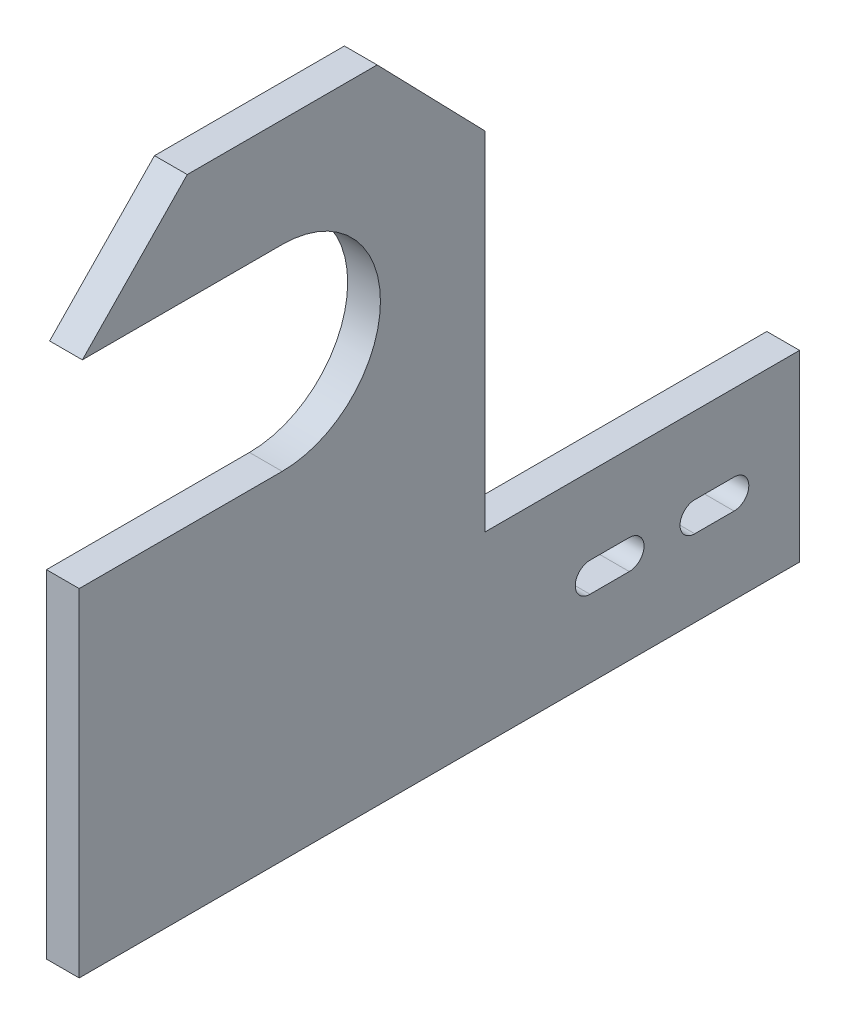
ISO-10303-21;
HEADER;
FILE_DESCRIPTION(('STEP AP214'),'2;1');
FILE_NAME('part.step','',(''),(''),'','','');
FILE_SCHEMA(('AUTOMOTIVE_DESIGN { 1 0 10303 214 1 1 1 1 }'));
ENDSEC;
DATA;
#1=APPLICATION_CONTEXT('core data for automotive mechanical design processes');
#2=APPLICATION_PROTOCOL_DEFINITION('international standard','automotive_design',2000,#1);
#3=PRODUCT_CONTEXT('',#1,'mechanical');
#4=PRODUCT('Part','Part','',(#3));
#5=PRODUCT_RELATED_PRODUCT_CATEGORY('part','',(#4));
#6=PRODUCT_DEFINITION_FORMATION('','',#4);
#7=PRODUCT_DEFINITION_CONTEXT('part definition',#1,'design');
#8=PRODUCT_DEFINITION('design','',#6,#7);
#9=PRODUCT_DEFINITION_SHAPE('','',#8);
#10=(LENGTH_UNIT() NAMED_UNIT(*) SI_UNIT(.MILLI.,.METRE.));
#11=(NAMED_UNIT(*) PLANE_ANGLE_UNIT() SI_UNIT($,.RADIAN.));
#12=(NAMED_UNIT(*) SI_UNIT($,.STERADIAN.) SOLID_ANGLE_UNIT());
#13=UNCERTAINTY_MEASURE_WITH_UNIT(LENGTH_MEASURE(1.E-05),#10,'distance_accuracy_value','');
#14=(GEOMETRIC_REPRESENTATION_CONTEXT(3) GLOBAL_UNCERTAINTY_ASSIGNED_CONTEXT((#13)) GLOBAL_UNIT_ASSIGNED_CONTEXT((#10,
#11,#12)) REPRESENTATION_CONTEXT('',''));
#15=CARTESIAN_POINT('',(0.,0.,0.));
#16=DIRECTION('',(0.,0.,1.));
#17=DIRECTION('',(1.,0.,0.));
#18=AXIS2_PLACEMENT_3D('',#15,#16,#17);
#19=CARTESIAN_POINT('',(-5.,49.5,-30.9999999999999));
#20=DIRECTION('',(0.,1.,0.));
#21=DIRECTION('',(0.,0.,1.));
#22=AXIS2_PLACEMENT_3D('',#19,#20,#21);
#23=PLANE('',#22);
#24=DIRECTION('',(0.,0.,1.));
#25=VECTOR('',#24,1.);
#26=CARTESIAN_POINT('',(0.,49.5,-30.9999999999999));
#27=LINE('',#26,#25);
#28=CARTESIAN_POINT('',(0.,49.5,-30.9999999999999));
#29=VERTEX_POINT('',#28);
#30=CARTESIAN_POINT('',(0.,49.5,-0.485294117647064));
#31=VERTEX_POINT('',#30);
#32=EDGE_CURVE('E143',#29,#31,#27,.T.);
#33=ORIENTED_EDGE('',*,*,#32,.T.);
#34=DIRECTION('',(1.,0.,0.));
#35=VECTOR('',#34,1.);
#36=CARTESIAN_POINT('',(-5.,49.5,-0.485294117647064));
#37=LINE('',#36,#35);
#38=CARTESIAN_POINT('',(-5.,49.5,-0.485294117647064));
#39=VERTEX_POINT('',#38);
#40=EDGE_CURVE('E11',#39,#31,#37,.T.);
#41=ORIENTED_EDGE('',*,*,#40,.F.);
#42=DIRECTION('',(0.,0.,1.));
#43=VECTOR('',#42,1.);
#44=CARTESIAN_POINT('',(-5.,49.5,-30.9999999999999));
#45=LINE('',#44,#43);
#46=CARTESIAN_POINT('',(-5.,49.5,-30.9999999999999));
#47=VERTEX_POINT('',#46);
#48=EDGE_CURVE('E167',#47,#39,#45,.T.);
#49=ORIENTED_EDGE('',*,*,#48,.F.);
#50=DIRECTION('',(1.,0.,0.));
#51=VECTOR('',#50,1.);
#52=CARTESIAN_POINT('',(-5.,49.5,-30.9999999999999));
#53=LINE('',#52,#51);
#54=EDGE_CURVE('E139',#47,#29,#53,.T.);
#55=ORIENTED_EDGE('',*,*,#54,.T.);
#56=EDGE_LOOP('',(#33,#41,#49,#55));
#57=FACE_BOUND('',#56,.T.);
#58=ADVANCED_FACE('F39',(#57),#23,.F.);
#59=CARTESIAN_POINT('',(-5.,49.5,-0.485294117647064));
#60=DIRECTION('',(0.,-0.69647537716866,-0.717580691628317));
#61=DIRECTION('',(0.,0.717580691628317,-0.69647537716866));
#62=AXIS2_PLACEMENT_3D('',#59,#60,#61);
#63=PLANE('',#62);
#64=DIRECTION('',(0.,0.717580691628317,-0.69647537716866));
#65=VECTOR('',#64,1.);
#66=CARTESIAN_POINT('',(0.,49.5,-0.485294117647064));
#67=LINE('',#66,#65);
#68=CARTESIAN_POINT('',(0.,66.,-16.5));
#69=VERTEX_POINT('',#68);
#70=EDGE_CURVE('E147',#31,#69,#67,.T.);
#71=ORIENTED_EDGE('',*,*,#70,.T.);
#72=DIRECTION('',(1.,0.,0.));
#73=VECTOR('',#72,1.);
#74=CARTESIAN_POINT('',(-5.,66.,-16.5));
#75=LINE('',#74,#73);
#76=CARTESIAN_POINT('',(-5.,66.,-16.5));
#77=VERTEX_POINT('',#76);
#78=EDGE_CURVE('E48',#77,#69,#75,.T.);
#79=ORIENTED_EDGE('',*,*,#78,.F.);
#80=DIRECTION('',(0.,0.717580691628317,-0.69647537716866));
#81=VECTOR('',#80,1.);
#82=CARTESIAN_POINT('',(-5.,49.5,-0.485294117647064));
#83=LINE('',#82,#81);
#84=EDGE_CURVE('E97',#39,#77,#83,.T.);
#85=ORIENTED_EDGE('',*,*,#84,.F.);
#86=ORIENTED_EDGE('',*,*,#40,.T.);
#87=EDGE_LOOP('',(#71,#79,#85,#86));
#88=FACE_BOUND('',#87,.T.);
#89=ADVANCED_FACE('F417',(#88),#63,.F.);
#90=CARTESIAN_POINT('',(-5.,66.,-16.5));
#91=DIRECTION('',(0.,-1.,0.));
#92=DIRECTION('',(0.,0.,-1.));
#93=AXIS2_PLACEMENT_3D('',#90,#91,#92);
#94=PLANE('',#93);
#95=DIRECTION('',(0.,0.,-1.));
#96=VECTOR('',#95,1.);
#97=CARTESIAN_POINT('',(0.,66.,-16.5));
#98=LINE('',#97,#96);
#99=CARTESIAN_POINT('',(0.,66.,-45.5));
#100=VERTEX_POINT('',#99);
#101=EDGE_CURVE('E150',#69,#100,#98,.T.);
#102=ORIENTED_EDGE('',*,*,#101,.T.);
#103=DIRECTION('',(1.,0.,0.));
#104=VECTOR('',#103,1.);
#105=CARTESIAN_POINT('',(-5.,66.,-45.5));
#106=LINE('',#105,#104);
#107=CARTESIAN_POINT('',(-5.,66.,-45.5));
#108=VERTEX_POINT('',#107);
#109=EDGE_CURVE('E174',#108,#100,#106,.T.);
#110=ORIENTED_EDGE('',*,*,#109,.F.);
#111=DIRECTION('',(0.,0.,-1.));
#112=VECTOR('',#111,1.);
#113=CARTESIAN_POINT('',(-5.,66.,-16.5));
#114=LINE('',#113,#112);
#115=EDGE_CURVE('E184',#77,#108,#114,.T.);
#116=ORIENTED_EDGE('',*,*,#115,.F.);
#117=ORIENTED_EDGE('',*,*,#78,.T.);
#118=EDGE_LOOP('',(#102,#110,#116,#117));
#119=FACE_BOUND('',#118,.T.);
#120=ADVANCED_FACE('F182',(#119),#94,.F.);
#121=CARTESIAN_POINT('',(-5.,66.,-45.5));
#122=DIRECTION('',(0.,-0.69647537716866,0.717580691628316));
#123=DIRECTION('',(0.,-0.717580691628316,-0.69647537716866));
#124=AXIS2_PLACEMENT_3D('',#121,#122,#123);
#125=PLANE('',#124);
#126=DIRECTION('',(0.,-0.717580691628316,-0.69647537716866));
#127=VECTOR('',#126,1.);
#128=CARTESIAN_POINT('',(0.,66.,-45.5));
#129=LINE('',#128,#127);
#130=CARTESIAN_POINT('',(0.,49.,-62.));
#131=VERTEX_POINT('',#130);
#132=EDGE_CURVE('E153',#100,#131,#129,.T.);
#133=ORIENTED_EDGE('',*,*,#132,.T.);
#134=DIRECTION('',(1.,0.,0.));
#135=VECTOR('',#134,1.);
#136=CARTESIAN_POINT('',(-5.,49.,-62.));
#137=LINE('',#136,#135);
#138=CARTESIAN_POINT('',(-5.,49.,-62.));
#139=VERTEX_POINT('',#138);
#140=EDGE_CURVE('E132',#139,#131,#137,.T.);
#141=ORIENTED_EDGE('',*,*,#140,.F.);
#142=DIRECTION('',(0.,-0.717580691628316,-0.69647537716866));
#143=VECTOR('',#142,1.);
#144=CARTESIAN_POINT('',(-5.,66.,-45.5));
#145=LINE('',#144,#143);
#146=EDGE_CURVE('E197',#108,#139,#145,.T.);
#147=ORIENTED_EDGE('',*,*,#146,.F.);
#148=ORIENTED_EDGE('',*,*,#109,.T.);
#149=EDGE_LOOP('',(#133,#141,#147,#148));
#150=FACE_BOUND('',#149,.T.);
#151=ADVANCED_FACE('F194',(#150),#125,.F.);
#152=CARTESIAN_POINT('',(-5.,0.,-62.));
#153=DIRECTION('',(0.,0.,-1.));
#154=DIRECTION('',(-1.,0.,0.));
#155=AXIS2_PLACEMENT_3D('',#152,#153,#154);
#156=PLANE('',#155);
#157=DIRECTION('',(0.,1.,0.));
#158=VECTOR('',#157,1.);
#159=CARTESIAN_POINT('',(0.,0.,-62.));
#160=LINE('',#159,#158);
#161=CARTESIAN_POINT('',(0.,-4.,-62.));
#162=VERTEX_POINT('',#161);
#163=EDGE_CURVE('E157',#162,#131,#160,.T.);
#164=ORIENTED_EDGE('',*,*,#163,.F.);
#165=DIRECTION('',(1.,0.,0.));
#166=VECTOR('',#165,1.);
#167=CARTESIAN_POINT('',(-119.560027932957,-4.,-62.));
#168=LINE('',#167,#166);
#169=CARTESIAN_POINT('',(-5.,-4.,-62.));
#170=VERTEX_POINT('',#169);
#171=EDGE_CURVE('E214',#170,#162,#168,.T.);
#172=ORIENTED_EDGE('',*,*,#171,.F.);
#173=DIRECTION('',(0.,1.,0.));
#174=VECTOR('',#173,1.);
#175=CARTESIAN_POINT('',(-5.,0.,-62.));
#176=LINE('',#175,#174);
#177=EDGE_CURVE('E125',#170,#139,#176,.T.);
#178=ORIENTED_EDGE('',*,*,#177,.T.);
#179=ORIENTED_EDGE('',*,*,#140,.T.);
#180=EDGE_LOOP('',(#164,#172,#178,#179));
#181=FACE_BOUND('',#180,.T.);
#182=ADVANCED_FACE('F439',(#181),#156,.T.);
#183=CARTESIAN_POINT('',(-5.,0.,0.));
#184=DIRECTION('',(0.,0.,-1.));
#185=DIRECTION('',(-1.,0.,0.));
#186=AXIS2_PLACEMENT_3D('',#183,#184,#185);
#187=PLANE('',#186);
#188=DIRECTION('',(0.,1.,0.));
#189=VECTOR('',#188,1.);
#190=CARTESIAN_POINT('',(0.,0.,0.));
#191=LINE('',#190,#189);
#192=CARTESIAN_POINT('',(0.,-32.,0.));
#193=VERTEX_POINT('',#192);
#194=CARTESIAN_POINT('',(0.,19.5,0.));
#195=VERTEX_POINT('',#194);
#196=EDGE_CURVE('E130',#193,#195,#191,.T.);
#197=ORIENTED_EDGE('',*,*,#196,.T.);
#198=DIRECTION('',(1.,0.,0.));
#199=VECTOR('',#198,1.);
#200=CARTESIAN_POINT('',(-5.,19.5,0.));
#201=LINE('',#200,#199);
#202=CARTESIAN_POINT('',(-5.,19.5,0.));
#203=VERTEX_POINT('',#202);
#204=EDGE_CURVE('E127',#203,#195,#201,.T.);
#205=ORIENTED_EDGE('',*,*,#204,.F.);
#206=DIRECTION('',(0.,1.,0.));
#207=VECTOR('',#206,1.);
#208=CARTESIAN_POINT('',(-5.,0.,0.));
#209=LINE('',#208,#207);
#210=CARTESIAN_POINT('',(-5.,-32.,0.));
#211=VERTEX_POINT('',#210);
#212=EDGE_CURVE('E111',#211,#203,#209,.T.);
#213=ORIENTED_EDGE('',*,*,#212,.F.);
#214=DIRECTION('',(1.,0.,0.));
#215=VECTOR('',#214,1.);
#216=CARTESIAN_POINT('',(-119.560027932957,-32.,0.));
#217=LINE('',#216,#215);
#218=EDGE_CURVE('E215',#211,#193,#217,.T.);
#219=ORIENTED_EDGE('',*,*,#218,.T.);
#220=EDGE_LOOP('',(#197,#205,#213,#219));
#221=FACE_BOUND('',#220,.T.);
#222=ADVANCED_FACE('F128',(#221),#187,.F.);
#223=CARTESIAN_POINT('',(-5.,19.5,0.));
#224=DIRECTION('',(0.,-1.,0.));
#225=DIRECTION('',(0.,0.,-1.));
#226=AXIS2_PLACEMENT_3D('',#223,#224,#225);
#227=PLANE('',#226);
#228=DIRECTION('',(0.,0.,-1.));
#229=VECTOR('',#228,1.);
#230=CARTESIAN_POINT('',(0.,19.5,0.));
#231=LINE('',#230,#229);
#232=CARTESIAN_POINT('',(0.,19.5,-31.));
#233=VERTEX_POINT('',#232);
#234=EDGE_CURVE('E83',#195,#233,#231,.T.);
#235=ORIENTED_EDGE('',*,*,#234,.T.);
#236=DIRECTION('',(1.,0.,0.));
#237=VECTOR('',#236,1.);
#238=CARTESIAN_POINT('',(-5.,19.5,-31.));
#239=LINE('',#238,#237);
#240=CARTESIAN_POINT('',(-5.,19.5,-31.));
#241=VERTEX_POINT('',#240);
#242=EDGE_CURVE('E133',#241,#233,#239,.T.);
#243=ORIENTED_EDGE('',*,*,#242,.F.);
#244=DIRECTION('',(0.,0.,-1.));
#245=VECTOR('',#244,1.);
#246=CARTESIAN_POINT('',(-5.,19.5,0.));
#247=LINE('',#246,#245);
#248=EDGE_CURVE('E116',#203,#241,#247,.T.);
#249=ORIENTED_EDGE('',*,*,#248,.F.);
#250=ORIENTED_EDGE('',*,*,#204,.T.);
#251=EDGE_LOOP('',(#235,#243,#249,#250));
#252=FACE_BOUND('',#251,.T.);
#253=ADVANCED_FACE('F135',(#252),#227,.F.);
#254=CARTESIAN_POINT('',(-5.,34.5,-31.));
#255=DIRECTION('',(1.,0.,0.));
#256=DIRECTION('',(0.,0.,-1.));
#257=AXIS2_PLACEMENT_3D('',#254,#255,#256);
#258=CYLINDRICAL_SURFACE('',#257,15.);
#259=CARTESIAN_POINT('',(0.,34.5,-31.));
#260=DIRECTION('',(1.,0.,0.));
#261=DIRECTION('',(0.,0.,-1.));
#262=AXIS2_PLACEMENT_3D('',#259,#260,#261);
#263=CIRCLE('',#262,15.);
#264=EDGE_CURVE('E89',#233,#29,#263,.T.);
#265=ORIENTED_EDGE('',*,*,#264,.T.);
#266=ORIENTED_EDGE('',*,*,#54,.F.);
#267=CARTESIAN_POINT('',(-5.,34.5,-31.));
#268=DIRECTION('',(1.,0.,0.));
#269=DIRECTION('',(0.,0.,-1.));
#270=AXIS2_PLACEMENT_3D('',#267,#268,#269);
#271=CIRCLE('',#270,15.);
#272=EDGE_CURVE('E56',#241,#47,#271,.T.);
#273=ORIENTED_EDGE('',*,*,#272,.F.);
#274=ORIENTED_EDGE('',*,*,#242,.T.);
#275=EDGE_LOOP('',(#265,#266,#273,#274));
#276=FACE_BOUND('',#275,.T.);
#277=ADVANCED_FACE('F465',(#276),#258,.F.);
#278=CARTESIAN_POINT('',(-5.,34.5,-31.));
#279=DIRECTION('',(1.,0.,0.));
#280=DIRECTION('',(0.,0.,-1.));
#281=AXIS2_PLACEMENT_3D('',#278,#279,#280);
#282=PLANE('',#281);
#283=ORIENTED_EDGE('',*,*,#48,.T.);
#284=ORIENTED_EDGE('',*,*,#84,.T.);
#285=ORIENTED_EDGE('',*,*,#115,.T.);
#286=ORIENTED_EDGE('',*,*,#146,.T.);
#287=ORIENTED_EDGE('',*,*,#177,.F.);
#288=DIRECTION('',(0.,0.,-1.));
#289=VECTOR('',#288,1.);
#290=CARTESIAN_POINT('',(-5.,-4.,-62.));
#291=LINE('',#290,#289);
#292=CARTESIAN_POINT('',(-5.,-4.,-110.));
#293=VERTEX_POINT('',#292);
#294=EDGE_CURVE('E304',#170,#293,#291,.T.);
#295=ORIENTED_EDGE('',*,*,#294,.T.);
#296=DIRECTION('',(0.,-1.,0.));
#297=VECTOR('',#296,1.);
#298=CARTESIAN_POINT('',(-5.,-32.,-110.));
#299=LINE('',#298,#297);
#300=CARTESIAN_POINT('',(-5.00000000000003,-32.,-110.));
#301=VERTEX_POINT('',#300);
#302=EDGE_CURVE('E309',#293,#301,#299,.T.);
#303=ORIENTED_EDGE('',*,*,#302,.T.);
#304=DIRECTION('',(0.,0.,1.));
#305=VECTOR('',#304,1.);
#306=CARTESIAN_POINT('',(-5.,-32.,0.));
#307=LINE('',#306,#305);
#308=EDGE_CURVE('E120',#301,#211,#307,.T.);
#309=ORIENTED_EDGE('',*,*,#308,.T.);
#310=ORIENTED_EDGE('',*,*,#212,.T.);
#311=ORIENTED_EDGE('',*,*,#248,.T.);
#312=ORIENTED_EDGE('',*,*,#272,.T.);
#313=EDGE_LOOP('',(#283,#284,#285,#286,#287,#295,#303,#309,#310,#311,#312));
#314=FACE_BOUND('',#313,.T.);
#315=DIRECTION('',(0.,0.,1.));
#316=VECTOR('',#315,1.);
#317=CARTESIAN_POINT('',(-5.,-20.25,-93.9999999999999));
#318=LINE('',#317,#316);
#319=CARTESIAN_POINT('',(-5.,-20.25,-99.9999999999999));
#320=VERTEX_POINT('',#319);
#321=CARTESIAN_POINT('',(-5.00000000000003,-20.25,-93.9999999999999));
#322=VERTEX_POINT('',#321);
#323=EDGE_CURVE('E209',#320,#322,#318,.T.);
#324=ORIENTED_EDGE('',*,*,#323,.F.);
#325=CARTESIAN_POINT('',(-5.,-18.,-99.9999999999999));
#326=DIRECTION('',(1.,0.,0.));
#327=DIRECTION('',(0.,0.,-1.));
#328=AXIS2_PLACEMENT_3D('',#325,#326,#327);
#329=CIRCLE('',#328,2.25000000000001);
#330=CARTESIAN_POINT('',(-5.,-15.75,-99.9999999999999));
#331=VERTEX_POINT('',#330);
#332=EDGE_CURVE('E320',#331,#320,#329,.F.);
#333=ORIENTED_EDGE('',*,*,#332,.F.);
#334=DIRECTION('',(0.,0.,-1.));
#335=VECTOR('',#334,1.);
#336=CARTESIAN_POINT('',(-5.,-15.75,-93.9999999999999));
#337=LINE('',#336,#335);
#338=CARTESIAN_POINT('',(-5.,-15.75,-93.9999999999999));
#339=VERTEX_POINT('',#338);
#340=EDGE_CURVE('E333',#339,#331,#337,.T.);
#341=ORIENTED_EDGE('',*,*,#340,.F.);
#342=CARTESIAN_POINT('',(-5.,-18.,-93.9999999999999));
#343=DIRECTION('',(1.,0.,0.));
#344=DIRECTION('',(0.,0.,-1.));
#345=AXIS2_PLACEMENT_3D('',#342,#343,#344);
#346=CIRCLE('',#345,2.25000000000001);
#347=EDGE_CURVE('E308',#322,#339,#346,.F.);
#348=ORIENTED_EDGE('',*,*,#347,.F.);
#349=EDGE_LOOP('',(#324,#333,#341,#348));
#350=FACE_BOUND('',#349,.T.);
#351=DIRECTION('',(0.,0.,1.));
#352=VECTOR('',#351,1.);
#353=CARTESIAN_POINT('',(-5.,-20.25,-77.9999999999999));
#354=LINE('',#353,#352);
#355=CARTESIAN_POINT('',(-5.,-20.25,-83.9999999999999));
#356=VERTEX_POINT('',#355);
#357=CARTESIAN_POINT('',(-5.00000000000003,-20.25,-77.9999999999999));
#358=VERTEX_POINT('',#357);
#359=EDGE_CURVE('E213',#356,#358,#354,.T.);
#360=ORIENTED_EDGE('',*,*,#359,.F.);
#361=CARTESIAN_POINT('',(-5.,-18.,-83.9999999999999));
#362=DIRECTION('',(1.,0.,0.));
#363=DIRECTION('',(0.,0.,-1.));
#364=AXIS2_PLACEMENT_3D('',#361,#362,#363);
#365=CIRCLE('',#364,2.25000000000001);
#366=CARTESIAN_POINT('',(-5.,-15.75,-83.9999999999999));
#367=VERTEX_POINT('',#366);
#368=EDGE_CURVE('E314',#367,#356,#365,.F.);
#369=ORIENTED_EDGE('',*,*,#368,.F.);
#370=DIRECTION('',(0.,0.,-1.));
#371=VECTOR('',#370,1.);
#372=CARTESIAN_POINT('',(-5.,-15.75,-77.9999999999999));
#373=LINE('',#372,#371);
#374=CARTESIAN_POINT('',(-5.,-15.75,-77.9999999999999));
#375=VERTEX_POINT('',#374);
#376=EDGE_CURVE('E319',#375,#367,#373,.T.);
#377=ORIENTED_EDGE('',*,*,#376,.F.);
#378=CARTESIAN_POINT('',(-5.,-18.,-77.9999999999999));
#379=DIRECTION('',(1.,0.,0.));
#380=DIRECTION('',(0.,0.,-1.));
#381=AXIS2_PLACEMENT_3D('',#378,#379,#380);
#382=CIRCLE('',#381,2.25000000000001);
#383=EDGE_CURVE('E315',#358,#375,#382,.F.);
#384=ORIENTED_EDGE('',*,*,#383,.F.);
#385=EDGE_LOOP('',(#360,#369,#377,#384));
#386=FACE_BOUND('',#385,.T.);
#387=ADVANCED_FACE('F113',(#314,#350,#386),#282,.F.);
#388=CARTESIAN_POINT('',(0.,34.5,-31.));
#389=DIRECTION('',(1.,0.,0.));
#390=DIRECTION('',(0.,0.,-1.));
#391=AXIS2_PLACEMENT_3D('',#388,#389,#390);
#392=PLANE('',#391);
#393=ORIENTED_EDGE('',*,*,#32,.F.);
#394=ORIENTED_EDGE('',*,*,#264,.F.);
#395=ORIENTED_EDGE('',*,*,#234,.F.);
#396=ORIENTED_EDGE('',*,*,#196,.F.);
#397=DIRECTION('',(0.,0.,-1.));
#398=VECTOR('',#397,1.);
#399=CARTESIAN_POINT('',(0.,-32.,0.));
#400=LINE('',#399,#398);
#401=CARTESIAN_POINT('',(0.,-32.,-110.));
#402=VERTEX_POINT('',#401);
#403=EDGE_CURVE('E236',#193,#402,#400,.T.);
#404=ORIENTED_EDGE('',*,*,#403,.T.);
#405=DIRECTION('',(0.,1.,0.));
#406=VECTOR('',#405,1.);
#407=CARTESIAN_POINT('',(0.,-32.,-110.));
#408=LINE('',#407,#406);
#409=CARTESIAN_POINT('',(0.,-4.,-110.));
#410=VERTEX_POINT('',#409);
#411=EDGE_CURVE('E232',#402,#410,#408,.T.);
#412=ORIENTED_EDGE('',*,*,#411,.T.);
#413=DIRECTION('',(0.,0.,1.));
#414=VECTOR('',#413,1.);
#415=CARTESIAN_POINT('',(0.,-4.,-62.));
#416=LINE('',#415,#414);
#417=EDGE_CURVE('E219',#410,#162,#416,.T.);
#418=ORIENTED_EDGE('',*,*,#417,.T.);
#419=ORIENTED_EDGE('',*,*,#163,.T.);
#420=ORIENTED_EDGE('',*,*,#132,.F.);
#421=ORIENTED_EDGE('',*,*,#101,.F.);
#422=ORIENTED_EDGE('',*,*,#70,.F.);
#423=EDGE_LOOP('',(#393,#394,#395,#396,#404,#412,#418,#419,#420,#421,#422));
#424=FACE_BOUND('',#423,.T.);
#425=CARTESIAN_POINT('',(0.,-18.,-93.9999999999999));
#426=DIRECTION('',(1.,0.,0.));
#427=DIRECTION('',(0.,0.,-1.));
#428=AXIS2_PLACEMENT_3D('',#425,#426,#427);
#429=CIRCLE('',#428,2.25000000000001);
#430=CARTESIAN_POINT('',(0.,-15.75,-93.9999999999999));
#431=VERTEX_POINT('',#430);
#432=CARTESIAN_POINT('',(0.,-20.25,-93.9999999999999));
#433=VERTEX_POINT('',#432);
#434=EDGE_CURVE('E300',#431,#433,#429,.T.);
#435=ORIENTED_EDGE('',*,*,#434,.F.);
#436=DIRECTION('',(0.,0.,1.));
#437=VECTOR('',#436,1.);
#438=CARTESIAN_POINT('',(0.,-15.75,-93.9999999999999));
#439=LINE('',#438,#437);
#440=CARTESIAN_POINT('',(0.,-15.75,-99.9999999999999));
#441=VERTEX_POINT('',#440);
#442=EDGE_CURVE('E278',#441,#431,#439,.T.);
#443=ORIENTED_EDGE('',*,*,#442,.F.);
#444=CARTESIAN_POINT('',(0.,-18.,-99.9999999999999));
#445=DIRECTION('',(1.,0.,0.));
#446=DIRECTION('',(0.,0.,-1.));
#447=AXIS2_PLACEMENT_3D('',#444,#445,#446);
#448=CIRCLE('',#447,2.25000000000001);
#449=CARTESIAN_POINT('',(0.,-20.25,-99.9999999999999));
#450=VERTEX_POINT('',#449);
#451=EDGE_CURVE('E292',#450,#441,#448,.T.);
#452=ORIENTED_EDGE('',*,*,#451,.F.);
#453=DIRECTION('',(0.,0.,-1.));
#454=VECTOR('',#453,1.);
#455=CARTESIAN_POINT('',(0.,-20.25,-93.9999999999999));
#456=LINE('',#455,#454);
#457=EDGE_CURVE('E296',#433,#450,#456,.T.);
#458=ORIENTED_EDGE('',*,*,#457,.F.);
#459=EDGE_LOOP('',(#435,#443,#452,#458));
#460=FACE_BOUND('',#459,.T.);
#461=CARTESIAN_POINT('',(0.,-18.,-77.9999999999999));
#462=DIRECTION('',(1.,0.,0.));
#463=DIRECTION('',(0.,0.,-1.));
#464=AXIS2_PLACEMENT_3D('',#461,#462,#463);
#465=CIRCLE('',#464,2.25000000000001);
#466=CARTESIAN_POINT('',(0.,-15.75,-77.9999999999999));
#467=VERTEX_POINT('',#466);
#468=CARTESIAN_POINT('',(0.,-20.25,-77.9999999999999));
#469=VERTEX_POINT('',#468);
#470=EDGE_CURVE('E268',#467,#469,#465,.T.);
#471=ORIENTED_EDGE('',*,*,#470,.F.);
#472=DIRECTION('',(0.,0.,1.));
#473=VECTOR('',#472,1.);
#474=CARTESIAN_POINT('',(0.,-15.75,-77.9999999999999));
#475=LINE('',#474,#473);
#476=CARTESIAN_POINT('',(0.,-15.75,-83.9999999999999));
#477=VERTEX_POINT('',#476);
#478=EDGE_CURVE('E246',#477,#467,#475,.T.);
#479=ORIENTED_EDGE('',*,*,#478,.F.);
#480=CARTESIAN_POINT('',(0.,-18.,-83.9999999999999));
#481=DIRECTION('',(1.,0.,0.));
#482=DIRECTION('',(0.,0.,-1.));
#483=AXIS2_PLACEMENT_3D('',#480,#481,#482);
#484=CIRCLE('',#483,2.25000000000001);
#485=CARTESIAN_POINT('',(0.,-20.25,-83.9999999999999));
#486=VERTEX_POINT('',#485);
#487=EDGE_CURVE('E260',#486,#477,#484,.T.);
#488=ORIENTED_EDGE('',*,*,#487,.F.);
#489=DIRECTION('',(0.,0.,-1.));
#490=VECTOR('',#489,1.);
#491=CARTESIAN_POINT('',(0.,-20.25,-77.9999999999999));
#492=LINE('',#491,#490);
#493=EDGE_CURVE('E264',#469,#486,#492,.T.);
#494=ORIENTED_EDGE('',*,*,#493,.F.);
#495=EDGE_LOOP('',(#471,#479,#488,#494));
#496=FACE_BOUND('',#495,.T.);
#497=ADVANCED_FACE('F188',(#424,#460,#496),#392,.T.);
#498=CARTESIAN_POINT('',(-119.560027932957,-32.,0.));
#499=DIRECTION('',(0.,-1.,0.));
#500=DIRECTION('',(0.,0.,-1.));
#501=AXIS2_PLACEMENT_3D('',#498,#499,#500);
#502=PLANE('',#501);
#503=ORIENTED_EDGE('',*,*,#308,.F.);
#504=DIRECTION('',(1.,0.,0.));
#505=VECTOR('',#504,1.);
#506=CARTESIAN_POINT('',(-119.560027932957,-32.,-110.));
#507=LINE('',#506,#505);
#508=EDGE_CURVE('E218',#301,#402,#507,.T.);
#509=ORIENTED_EDGE('',*,*,#508,.T.);
#510=ORIENTED_EDGE('',*,*,#403,.F.);
#511=ORIENTED_EDGE('',*,*,#218,.F.);
#512=EDGE_LOOP('',(#503,#509,#510,#511));
#513=FACE_BOUND('',#512,.T.);
#514=ADVANCED_FACE('F426',(#513),#502,.T.);
#515=CARTESIAN_POINT('',(-119.560027932957,-32.,-110.));
#516=DIRECTION('',(0.,0.,-1.));
#517=DIRECTION('',(-1.,0.,0.));
#518=AXIS2_PLACEMENT_3D('',#515,#516,#517);
#519=PLANE('',#518);
#520=ORIENTED_EDGE('',*,*,#302,.F.);
#521=DIRECTION('',(1.,0.,0.));
#522=VECTOR('',#521,1.);
#523=CARTESIAN_POINT('',(-119.560027932957,-4.,-110.));
#524=LINE('',#523,#522);
#525=EDGE_CURVE('E223',#293,#410,#524,.T.);
#526=ORIENTED_EDGE('',*,*,#525,.T.);
#527=ORIENTED_EDGE('',*,*,#411,.F.);
#528=ORIENTED_EDGE('',*,*,#508,.F.);
#529=EDGE_LOOP('',(#520,#526,#527,#528));
#530=FACE_BOUND('',#529,.T.);
#531=ADVANCED_FACE('F431',(#530),#519,.T.);
#532=CARTESIAN_POINT('',(-119.560027932957,-4.,-62.));
#533=DIRECTION('',(0.,1.,0.));
#534=DIRECTION('',(0.,0.,1.));
#535=AXIS2_PLACEMENT_3D('',#532,#533,#534);
#536=PLANE('',#535);
#537=ORIENTED_EDGE('',*,*,#294,.F.);
#538=ORIENTED_EDGE('',*,*,#171,.T.);
#539=ORIENTED_EDGE('',*,*,#417,.F.);
#540=ORIENTED_EDGE('',*,*,#525,.F.);
#541=EDGE_LOOP('',(#537,#538,#539,#540));
#542=FACE_BOUND('',#541,.T.);
#543=ADVANCED_FACE('F436',(#542),#536,.T.);
#544=CARTESIAN_POINT('',(-119.560027932957,-20.25,-77.9999999999999));
#545=DIRECTION('',(0.,-1.,0.));
#546=DIRECTION('',(0.,0.,-1.));
#547=AXIS2_PLACEMENT_3D('',#544,#545,#546);
#548=PLANE('',#547);
#549=DIRECTION('',(1.,0.,0.));
#550=VECTOR('',#549,1.);
#551=CARTESIAN_POINT('',(-119.560027932957,-20.25,-83.9999999999999));
#552=LINE('',#551,#550);
#553=EDGE_CURVE('E245',#356,#486,#552,.T.);
#554=ORIENTED_EDGE('',*,*,#553,.F.);
#555=ORIENTED_EDGE('',*,*,#359,.T.);
#556=DIRECTION('',(1.,0.,0.));
#557=VECTOR('',#556,1.);
#558=CARTESIAN_POINT('',(-119.560027932957,-20.25,-77.9999999999999));
#559=LINE('',#558,#557);
#560=EDGE_CURVE('E241',#358,#469,#559,.T.);
#561=ORIENTED_EDGE('',*,*,#560,.T.);
#562=ORIENTED_EDGE('',*,*,#493,.T.);
#563=EDGE_LOOP('',(#554,#555,#561,#562));
#564=FACE_BOUND('',#563,.T.);
#565=ADVANCED_FACE('F526',(#564),#548,.F.);
#566=CARTESIAN_POINT('',(-119.560027932957,-18.,-83.9999999999999));
#567=DIRECTION('',(1.,0.,0.));
#568=DIRECTION('',(0.,0.,-1.));
#569=AXIS2_PLACEMENT_3D('',#566,#567,#568);
#570=CYLINDRICAL_SURFACE('',#569,2.25000000000001);
#571=DIRECTION('',(1.,0.,0.));
#572=VECTOR('',#571,1.);
#573=CARTESIAN_POINT('',(-119.560027932957,-15.75,-83.9999999999999));
#574=LINE('',#573,#572);
#575=EDGE_CURVE('E250',#367,#477,#574,.T.);
#576=ORIENTED_EDGE('',*,*,#575,.F.);
#577=ORIENTED_EDGE('',*,*,#368,.T.);
#578=ORIENTED_EDGE('',*,*,#553,.T.);
#579=ORIENTED_EDGE('',*,*,#487,.T.);
#580=EDGE_LOOP('',(#576,#577,#578,#579));
#581=FACE_BOUND('',#580,.T.);
#582=ADVANCED_FACE('F535',(#581),#570,.F.);
#583=CARTESIAN_POINT('',(-119.560027932957,-15.75,-77.9999999999999));
#584=DIRECTION('',(0.,1.,0.));
#585=DIRECTION('',(0.,0.,1.));
#586=AXIS2_PLACEMENT_3D('',#583,#584,#585);
#587=PLANE('',#586);
#588=DIRECTION('',(1.,0.,0.));
#589=VECTOR('',#588,1.);
#590=CARTESIAN_POINT('',(-119.560027932957,-15.75,-77.9999999999999));
#591=LINE('',#590,#589);
#592=EDGE_CURVE('E240',#375,#467,#591,.T.);
#593=ORIENTED_EDGE('',*,*,#592,.F.);
#594=ORIENTED_EDGE('',*,*,#376,.T.);
#595=ORIENTED_EDGE('',*,*,#575,.T.);
#596=ORIENTED_EDGE('',*,*,#478,.T.);
#597=EDGE_LOOP('',(#593,#594,#595,#596));
#598=FACE_BOUND('',#597,.T.);
#599=ADVANCED_FACE('F545',(#598),#587,.F.);
#600=CARTESIAN_POINT('',(-119.560027932957,-18.,-77.9999999999999));
#601=DIRECTION('',(1.,0.,0.));
#602=DIRECTION('',(0.,0.,-1.));
#603=AXIS2_PLACEMENT_3D('',#600,#601,#602);
#604=CYLINDRICAL_SURFACE('',#603,2.25000000000001);
#605=ORIENTED_EDGE('',*,*,#560,.F.);
#606=ORIENTED_EDGE('',*,*,#383,.T.);
#607=ORIENTED_EDGE('',*,*,#592,.T.);
#608=ORIENTED_EDGE('',*,*,#470,.T.);
#609=EDGE_LOOP('',(#605,#606,#607,#608));
#610=FACE_BOUND('',#609,.T.);
#611=ADVANCED_FACE('F555',(#610),#604,.F.);
#612=CARTESIAN_POINT('',(-119.560027932957,-20.25,-93.9999999999999));
#613=DIRECTION('',(0.,-1.,0.));
#614=DIRECTION('',(0.,0.,-1.));
#615=AXIS2_PLACEMENT_3D('',#612,#613,#614);
#616=PLANE('',#615);
#617=DIRECTION('',(1.,0.,0.));
#618=VECTOR('',#617,1.);
#619=CARTESIAN_POINT('',(-119.560027932957,-20.25,-99.9999999999999));
#620=LINE('',#619,#618);
#621=EDGE_CURVE('E277',#320,#450,#620,.T.);
#622=ORIENTED_EDGE('',*,*,#621,.F.);
#623=ORIENTED_EDGE('',*,*,#323,.T.);
#624=DIRECTION('',(1.,0.,0.));
#625=VECTOR('',#624,1.);
#626=CARTESIAN_POINT('',(-119.560027932957,-20.25,-93.9999999999999));
#627=LINE('',#626,#625);
#628=EDGE_CURVE('E273',#322,#433,#627,.T.);
#629=ORIENTED_EDGE('',*,*,#628,.T.);
#630=ORIENTED_EDGE('',*,*,#457,.T.);
#631=EDGE_LOOP('',(#622,#623,#629,#630));
#632=FACE_BOUND('',#631,.T.);
#633=ADVANCED_FACE('F350',(#632),#616,.F.);
#634=CARTESIAN_POINT('',(-119.560027932957,-18.,-99.9999999999999));
#635=DIRECTION('',(1.,0.,0.));
#636=DIRECTION('',(0.,0.,-1.));
#637=AXIS2_PLACEMENT_3D('',#634,#635,#636);
#638=CYLINDRICAL_SURFACE('',#637,2.25000000000001);
#639=DIRECTION('',(1.,0.,0.));
#640=VECTOR('',#639,1.);
#641=CARTESIAN_POINT('',(-119.560027932957,-15.75,-99.9999999999999));
#642=LINE('',#641,#640);
#643=EDGE_CURVE('E282',#331,#441,#642,.T.);
#644=ORIENTED_EDGE('',*,*,#643,.F.);
#645=ORIENTED_EDGE('',*,*,#332,.T.);
#646=ORIENTED_EDGE('',*,*,#621,.T.);
#647=ORIENTED_EDGE('',*,*,#451,.T.);
#648=EDGE_LOOP('',(#644,#645,#646,#647));
#649=FACE_BOUND('',#648,.T.);
#650=ADVANCED_FACE('F343',(#649),#638,.F.);
#651=CARTESIAN_POINT('',(-119.560027932957,-15.75,-93.9999999999999));
#652=DIRECTION('',(0.,1.,0.));
#653=DIRECTION('',(0.,0.,1.));
#654=AXIS2_PLACEMENT_3D('',#651,#652,#653);
#655=PLANE('',#654);
#656=DIRECTION('',(1.,0.,0.));
#657=VECTOR('',#656,1.);
#658=CARTESIAN_POINT('',(-119.560027932957,-15.75,-93.9999999999999));
#659=LINE('',#658,#657);
#660=EDGE_CURVE('E272',#339,#431,#659,.T.);
#661=ORIENTED_EDGE('',*,*,#660,.F.);
#662=ORIENTED_EDGE('',*,*,#340,.T.);
#663=ORIENTED_EDGE('',*,*,#643,.T.);
#664=ORIENTED_EDGE('',*,*,#442,.T.);
#665=EDGE_LOOP('',(#661,#662,#663,#664));
#666=FACE_BOUND('',#665,.T.);
#667=ADVANCED_FACE('F405',(#666),#655,.F.);
#668=CARTESIAN_POINT('',(-119.560027932957,-18.,-93.9999999999999));
#669=DIRECTION('',(1.,0.,0.));
#670=DIRECTION('',(0.,0.,-1.));
#671=AXIS2_PLACEMENT_3D('',#668,#669,#670);
#672=CYLINDRICAL_SURFACE('',#671,2.25000000000001);
#673=ORIENTED_EDGE('',*,*,#628,.F.);
#674=ORIENTED_EDGE('',*,*,#347,.T.);
#675=ORIENTED_EDGE('',*,*,#660,.T.);
#676=ORIENTED_EDGE('',*,*,#434,.T.);
#677=EDGE_LOOP('',(#673,#674,#675,#676));
#678=FACE_BOUND('',#677,.T.);
#679=ADVANCED_FACE('F407',(#678),#672,.F.);
#680=CLOSED_SHELL('',(#58,#89,#120,#151,#182,#222,#253,#277,#387,#497,#514,#531,#543,#565,#582,
#599,#611,#633,#650,#667,#679));
#681=MANIFOLD_SOLID_BREP('B2',#680);
#682=ADVANCED_BREP_SHAPE_REPRESENTATION('',(#18,#681),#14);
#683=SHAPE_DEFINITION_REPRESENTATION(#9,#682);
ENDSEC;
END-ISO-10303-21;
